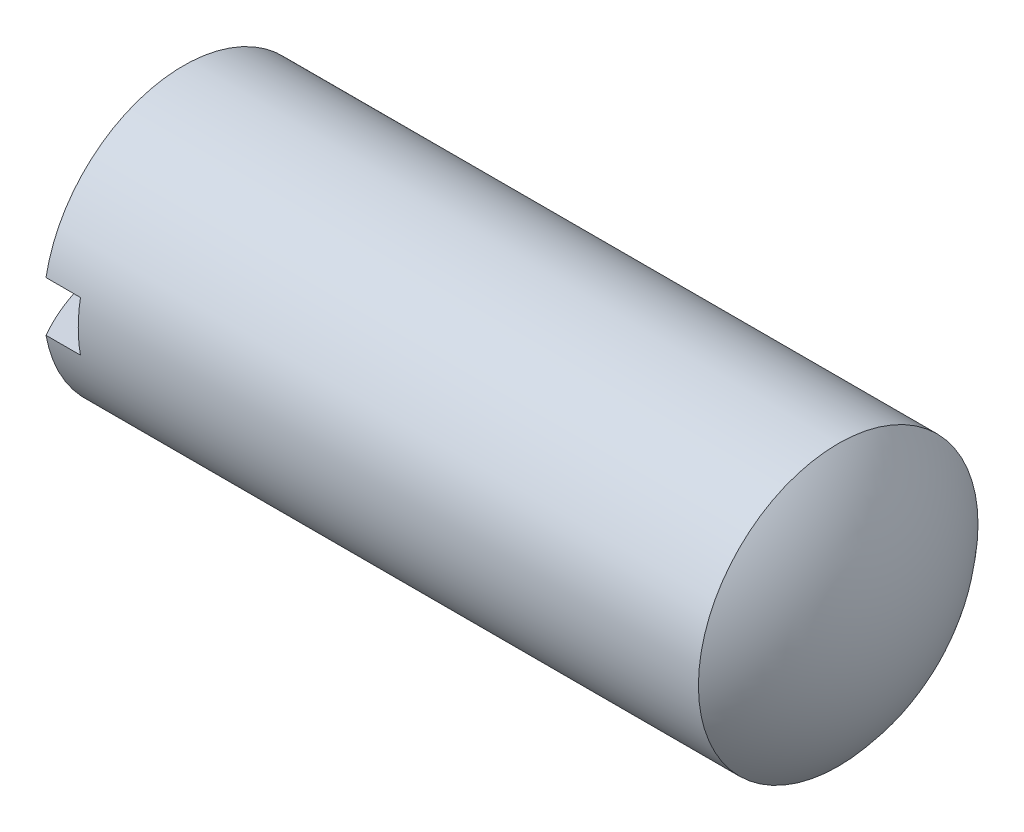
ISO-10303-21;
HEADER;
FILE_DESCRIPTION(('STEP AP214'),'2;1');
FILE_NAME('part.step','',(''),(''),'','','');
FILE_SCHEMA(('AUTOMOTIVE_DESIGN { 1 0 10303 214 1 1 1 1 }'));
ENDSEC;
DATA;
#1=APPLICATION_CONTEXT('core data for automotive mechanical design processes');
#2=APPLICATION_PROTOCOL_DEFINITION('international standard','automotive_design',2000,#1);
#3=PRODUCT_CONTEXT('',#1,'mechanical');
#4=PRODUCT('Part','Part','',(#3));
#5=PRODUCT_RELATED_PRODUCT_CATEGORY('part','',(#4));
#6=PRODUCT_DEFINITION_FORMATION('','',#4);
#7=PRODUCT_DEFINITION_CONTEXT('part definition',#1,'design');
#8=PRODUCT_DEFINITION('design','',#6,#7);
#9=PRODUCT_DEFINITION_SHAPE('','',#8);
#10=(LENGTH_UNIT() NAMED_UNIT(*) SI_UNIT(.MILLI.,.METRE.));
#11=(NAMED_UNIT(*) PLANE_ANGLE_UNIT() SI_UNIT($,.RADIAN.));
#12=(NAMED_UNIT(*) SI_UNIT($,.STERADIAN.) SOLID_ANGLE_UNIT());
#13=UNCERTAINTY_MEASURE_WITH_UNIT(LENGTH_MEASURE(1.E-05),#10,'distance_accuracy_value','');
#14=(GEOMETRIC_REPRESENTATION_CONTEXT(3) GLOBAL_UNCERTAINTY_ASSIGNED_CONTEXT((#13)) GLOBAL_UNIT_ASSIGNED_CONTEXT((#10,
#11,#12)) REPRESENTATION_CONTEXT('',''));
#15=CARTESIAN_POINT('',(0.,0.,0.));
#16=DIRECTION('',(0.,0.,1.));
#17=DIRECTION('',(1.,0.,0.));
#18=AXIS2_PLACEMENT_3D('',#15,#16,#17);
#19=CARTESIAN_POINT('',(19.05,0.,0.));
#20=DIRECTION('',(-1.,0.,0.));
#21=DIRECTION('',(0.,1.,0.));
#22=AXIS2_PLACEMENT_3D('',#19,#20,#21);
#23=SPHERICAL_SURFACE('',#22,19.05);
#24=CARTESIAN_POINT('',(19.05,1.7018,0.));
#25=DIRECTION('',(0.,-1.,0.));
#26=DIRECTION('',(0.,0.,-1.));
#27=AXIS2_PLACEMENT_3D('',#24,#25,#26);
#28=CIRCLE('',#27,18.9738340026469);
#29=CARTESIAN_POINT('',(2.55221605790645,1.7018,9.37173952689681));
#30=VERTEX_POINT('',#29);
#31=CARTESIAN_POINT('',(2.55221605790645,1.7018,-9.37173952689681));
#32=VERTEX_POINT('',#31);
#33=EDGE_CURVE('E93',#30,#32,#28,.T.);
#34=ORIENTED_EDGE('',*,*,#33,.F.);
#35=CARTESIAN_POINT('',(2.55221605790645,0.,0.));
#36=DIRECTION('',(-1.,0.,0.));
#37=DIRECTION('',(0.,0.,1.));
#38=AXIS2_PLACEMENT_3D('',#35,#36,#37);
#39=CIRCLE('',#38,9.525);
#40=EDGE_CURVE('E85',#30,#32,#39,.T.);
#41=ORIENTED_EDGE('',*,*,#40,.T.);
#42=EDGE_LOOP('',(#34,#41));
#43=FACE_BOUND('',#42,.T.);
#44=ADVANCED_FACE('F32',(#43),#23,.T.);
#45=CARTESIAN_POINT('',(19.05,-1.7018,0.));
#46=DIRECTION('',(0.,1.,0.));
#47=DIRECTION('',(0.,0.,1.));
#48=AXIS2_PLACEMENT_3D('',#45,#46,#47);
#49=CIRCLE('',#48,18.9738340026469);
#50=CARTESIAN_POINT('',(2.55221605790645,-1.7018,-9.37173952689681));
#51=VERTEX_POINT('',#50);
#52=CARTESIAN_POINT('',(2.55221605790645,-1.7018,9.37173952689681));
#53=VERTEX_POINT('',#52);
#54=EDGE_CURVE('E105',#51,#53,#49,.T.);
#55=ORIENTED_EDGE('',*,*,#54,.F.);
#56=EDGE_CURVE('E88',#51,#53,#39,.T.);
#57=ORIENTED_EDGE('',*,*,#56,.T.);
#58=EDGE_LOOP('',(#55,#57));
#59=FACE_BOUND('',#58,.T.);
#60=ADVANCED_FACE('F104',(#59),#23,.T.);
#61=CARTESIAN_POINT('',(-12.7,0.,0.));
#62=DIRECTION('',(-1.,0.,0.));
#63=DIRECTION('',(0.,0.,1.));
#64=AXIS2_PLACEMENT_3D('',#61,#62,#63);
#65=CYLINDRICAL_SURFACE('',#64,9.525);
#66=CARTESIAN_POINT('',(47.1574288368902,0.,0.));
#67=DIRECTION('',(-1.,0.,0.));
#68=DIRECTION('',(0.,0.,1.));
#69=AXIS2_PLACEMENT_3D('',#66,#67,#68);
#70=CIRCLE('',#69,9.525);
#71=CARTESIAN_POINT('',(47.1574288368902,0.,9.525));
#72=VERTEX_POINT('',#71);
#73=EDGE_CURVE('E87',#72,#72,#70,.T.);
#74=ORIENTED_EDGE('',*,*,#73,.T.);
#75=EDGE_LOOP('',(#74));
#76=FACE_BOUND('',#75,.T.);
#77=ORIENTED_EDGE('',*,*,#40,.F.);
#78=DIRECTION('',(-1.,0.,0.));
#79=VECTOR('',#78,1.);
#80=CARTESIAN_POINT('',(-12.7,1.7018,9.37173952689681));
#81=LINE('',#80,#79);
#82=CARTESIAN_POINT('',(4.9022,1.7018,9.37173952689681));
#83=VERTEX_POINT('',#82);
#84=EDGE_CURVE('E11',#30,#83,#81,.F.);
#85=ORIENTED_EDGE('',*,*,#84,.T.);
#86=CARTESIAN_POINT('',(4.9022,0.,0.));
#87=DIRECTION('',(1.,0.,0.));
#88=DIRECTION('',(0.,0.,-1.));
#89=AXIS2_PLACEMENT_3D('',#86,#87,#88);
#90=CIRCLE('',#89,9.525);
#91=CARTESIAN_POINT('',(4.9022,-1.7018,9.37173952689681));
#92=VERTEX_POINT('',#91);
#93=EDGE_CURVE('E68',#92,#83,#90,.F.);
#94=ORIENTED_EDGE('',*,*,#93,.F.);
#95=DIRECTION('',(-1.,0.,0.));
#96=VECTOR('',#95,1.);
#97=CARTESIAN_POINT('',(-12.7,-1.7018,9.37173952689681));
#98=LINE('',#97,#96);
#99=EDGE_CURVE('E39',#92,#53,#98,.T.);
#100=ORIENTED_EDGE('',*,*,#99,.T.);
#101=ORIENTED_EDGE('',*,*,#56,.F.);
#102=DIRECTION('',(-1.,0.,0.));
#103=VECTOR('',#102,1.);
#104=CARTESIAN_POINT('',(-12.7,-1.7018,-9.37173952689681));
#105=LINE('',#104,#103);
#106=CARTESIAN_POINT('',(4.9022,-1.7018,-9.37173952689681));
#107=VERTEX_POINT('',#106);
#108=EDGE_CURVE('E97',#51,#107,#105,.F.);
#109=ORIENTED_EDGE('',*,*,#108,.T.);
#110=CARTESIAN_POINT('',(4.9022,1.7018,-9.37173952689681));
#111=VERTEX_POINT('',#110);
#112=EDGE_CURVE('E77',#111,#107,#90,.F.);
#113=ORIENTED_EDGE('',*,*,#112,.F.);
#114=DIRECTION('',(-1.,0.,0.));
#115=VECTOR('',#114,1.);
#116=CARTESIAN_POINT('',(-12.7,1.7018,-9.37173952689681));
#117=LINE('',#116,#115);
#118=EDGE_CURVE('E75',#111,#32,#117,.T.);
#119=ORIENTED_EDGE('',*,*,#118,.T.);
#120=EDGE_LOOP('',(#77,#85,#94,#100,#101,#109,#113,#119));
#121=FACE_BOUND('',#120,.T.);
#122=ADVANCED_FACE('F83',(#76,#121),#65,.T.);
#123=CARTESIAN_POINT('',(36.5252,0.,0.));
#124=DIRECTION('',(-1.,0.,0.));
#125=DIRECTION('',(0.,1.,0.));
#126=AXIS2_PLACEMENT_3D('',#123,#124,#125);
#127=SPHERICAL_SURFACE('',#126,14.2748);
#128=ORIENTED_EDGE('',*,*,#73,.F.);
#129=EDGE_LOOP('',(#128));
#130=FACE_BOUND('',#129,.T.);
#131=ADVANCED_FACE('F115',(#130),#127,.T.);
#132=CARTESIAN_POINT('',(4.9022,1.7018,-9.52499999999999));
#133=DIRECTION('',(0.,-1.,0.));
#134=DIRECTION('',(0.,0.,-1.));
#135=AXIS2_PLACEMENT_3D('',#132,#133,#134);
#136=PLANE('',#135);
#137=ORIENTED_EDGE('',*,*,#33,.T.);
#138=ORIENTED_EDGE('',*,*,#118,.F.);
#139=DIRECTION('',(0.,0.,1.));
#140=VECTOR('',#139,1.);
#141=CARTESIAN_POINT('',(4.9022,1.7018,-9.52499999999999));
#142=LINE('',#141,#140);
#143=EDGE_CURVE('E46',#111,#83,#142,.T.);
#144=ORIENTED_EDGE('',*,*,#143,.T.);
#145=ORIENTED_EDGE('',*,*,#84,.F.);
#146=EDGE_LOOP('',(#137,#138,#144,#145));
#147=FACE_BOUND('',#146,.T.);
#148=ADVANCED_FACE('F78',(#147),#136,.T.);
#149=CARTESIAN_POINT('',(4.9022,-1.7018,-9.52499999999999));
#150=DIRECTION('',(0.,1.,0.));
#151=DIRECTION('',(0.,0.,1.));
#152=AXIS2_PLACEMENT_3D('',#149,#150,#151);
#153=PLANE('',#152);
#154=ORIENTED_EDGE('',*,*,#54,.T.);
#155=ORIENTED_EDGE('',*,*,#99,.F.);
#156=DIRECTION('',(0.,0.,-1.));
#157=VECTOR('',#156,1.);
#158=CARTESIAN_POINT('',(4.9022,-1.7018,-9.52499999999999));
#159=LINE('',#158,#157);
#160=EDGE_CURVE('E71',#92,#107,#159,.T.);
#161=ORIENTED_EDGE('',*,*,#160,.T.);
#162=ORIENTED_EDGE('',*,*,#108,.F.);
#163=EDGE_LOOP('',(#154,#155,#161,#162));
#164=FACE_BOUND('',#163,.T.);
#165=ADVANCED_FACE('F107',(#164),#153,.T.);
#166=CARTESIAN_POINT('',(4.9022,1.7018,-9.52499999999999));
#167=DIRECTION('',(1.,0.,0.));
#168=DIRECTION('',(0.,0.,-1.));
#169=AXIS2_PLACEMENT_3D('',#166,#167,#168);
#170=PLANE('',#169);
#171=ORIENTED_EDGE('',*,*,#160,.F.);
#172=ORIENTED_EDGE('',*,*,#93,.T.);
#173=ORIENTED_EDGE('',*,*,#143,.F.);
#174=ORIENTED_EDGE('',*,*,#112,.T.);
#175=EDGE_LOOP('',(#171,#172,#173,#174));
#176=FACE_BOUND('',#175,.T.);
#177=ADVANCED_FACE('F69',(#176),#170,.F.);
#178=CLOSED_SHELL('',(#44,#60,#122,#131,#148,#165,#177));
#179=MANIFOLD_SOLID_BREP('B2',#178);
#180=ADVANCED_BREP_SHAPE_REPRESENTATION('',(#18,#179),#14);
#181=SHAPE_DEFINITION_REPRESENTATION(#9,#180);
ENDSEC;
END-ISO-10303-21;
